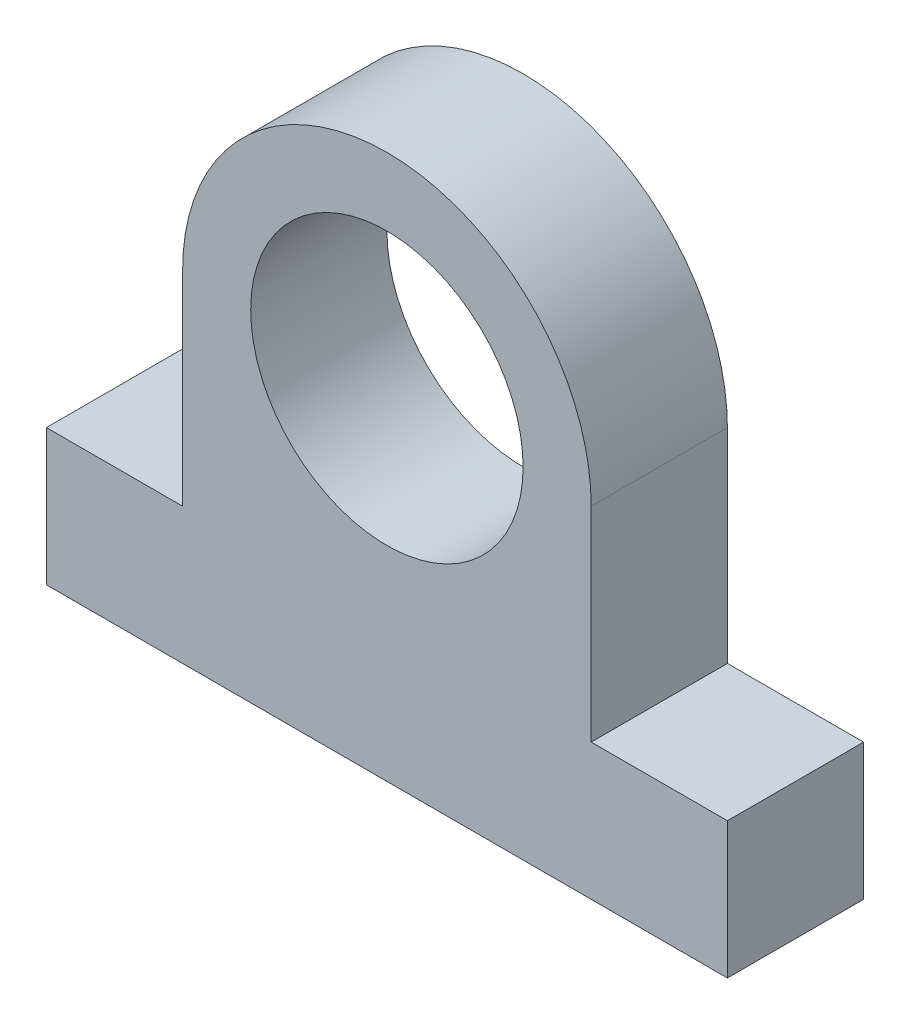
ISO-10303-21;
HEADER;
FILE_DESCRIPTION(('STEP AP214'),'2;1');
FILE_NAME('part.step','',(''),(''),'','','');
FILE_SCHEMA(('AUTOMOTIVE_DESIGN { 1 0 10303 214 1 1 1 1 }'));
ENDSEC;
DATA;
#1=APPLICATION_CONTEXT('core data for automotive mechanical design processes');
#2=APPLICATION_PROTOCOL_DEFINITION('international standard','automotive_design',2000,#1);
#3=PRODUCT_CONTEXT('',#1,'mechanical');
#4=PRODUCT('Part','Part','',(#3));
#5=PRODUCT_RELATED_PRODUCT_CATEGORY('part','',(#4));
#6=PRODUCT_DEFINITION_FORMATION('','',#4);
#7=PRODUCT_DEFINITION_CONTEXT('part definition',#1,'design');
#8=PRODUCT_DEFINITION('design','',#6,#7);
#9=PRODUCT_DEFINITION_SHAPE('','',#8);
#10=(LENGTH_UNIT() NAMED_UNIT(*) SI_UNIT(.MILLI.,.METRE.));
#11=(NAMED_UNIT(*) PLANE_ANGLE_UNIT() SI_UNIT($,.RADIAN.));
#12=(NAMED_UNIT(*) SI_UNIT($,.STERADIAN.) SOLID_ANGLE_UNIT());
#13=UNCERTAINTY_MEASURE_WITH_UNIT(LENGTH_MEASURE(1.E-05),#10,'distance_accuracy_value','');
#14=(GEOMETRIC_REPRESENTATION_CONTEXT(3) GLOBAL_UNCERTAINTY_ASSIGNED_CONTEXT((#13)) GLOBAL_UNIT_ASSIGNED_CONTEXT((#10,
#11,#12)) REPRESENTATION_CONTEXT('',''));
#15=CARTESIAN_POINT('',(0.,0.,0.));
#16=DIRECTION('',(0.,0.,1.));
#17=DIRECTION('',(1.,0.,0.));
#18=AXIS2_PLACEMENT_3D('',#15,#16,#17);
#19=CARTESIAN_POINT('',(0.110311447811456,19.9352377946128,10.));
#20=DIRECTION('',(0.,0.,-1.));
#21=DIRECTION('',(-1.,0.,0.));
#22=AXIS2_PLACEMENT_3D('',#19,#20,#21);
#23=CYLINDRICAL_SURFACE('',#22,15.);
#24=CARTESIAN_POINT('',(0.110311447811456,19.9352377946128,0.));
#25=DIRECTION('',(0.,0.,1.));
#26=DIRECTION('',(1.,0.,0.));
#27=AXIS2_PLACEMENT_3D('',#24,#25,#26);
#28=CIRCLE('',#27,15.);
#29=CARTESIAN_POINT('',(-14.8896885521885,19.9352377946128,0.));
#30=VERTEX_POINT('',#29);
#31=CARTESIAN_POINT('',(15.1103114478115,19.9352377946128,0.));
#32=VERTEX_POINT('',#31);
#33=EDGE_CURVE('E103',#30,#32,#28,.F.);
#34=ORIENTED_EDGE('',*,*,#33,.F.);
#35=DIRECTION('',(0.,0.,-1.));
#36=VECTOR('',#35,1.);
#37=CARTESIAN_POINT('',(-14.8896885521885,19.9352377946128,10.));
#38=LINE('',#37,#36);
#39=CARTESIAN_POINT('',(-14.8896885521885,19.9352377946128,10.));
#40=VERTEX_POINT('',#39);
#41=EDGE_CURVE('E11',#40,#30,#38,.T.);
#42=ORIENTED_EDGE('',*,*,#41,.F.);
#43=CARTESIAN_POINT('',(0.110311447811456,19.9352377946128,10.));
#44=DIRECTION('',(0.,0.,1.));
#45=DIRECTION('',(1.,0.,0.));
#46=AXIS2_PLACEMENT_3D('',#43,#44,#45);
#47=CIRCLE('',#46,15.);
#48=CARTESIAN_POINT('',(15.1103114478115,19.9352377946128,10.));
#49=VERTEX_POINT('',#48);
#50=EDGE_CURVE('E132',#40,#49,#47,.F.);
#51=ORIENTED_EDGE('',*,*,#50,.T.);
#52=DIRECTION('',(0.,0.,-1.));
#53=VECTOR('',#52,1.);
#54=CARTESIAN_POINT('',(15.1103114478115,19.9352377946128,10.));
#55=LINE('',#54,#53);
#56=EDGE_CURVE('E104',#49,#32,#55,.T.);
#57=ORIENTED_EDGE('',*,*,#56,.T.);
#58=EDGE_LOOP('',(#34,#42,#51,#57));
#59=FACE_BOUND('',#58,.T.);
#60=ADVANCED_FACE('F31',(#59),#23,.T.);
#61=CARTESIAN_POINT('',(-14.8896885521886,-51.4683054412894,10.));
#62=DIRECTION('',(-1.,0.,0.));
#63=DIRECTION('',(0.,-1.,0.));
#64=AXIS2_PLACEMENT_3D('',#61,#62,#63);
#65=PLANE('',#64);
#66=DIRECTION('',(0.,1.,0.));
#67=VECTOR('',#66,1.);
#68=CARTESIAN_POINT('',(-14.8896885521886,-51.4683054412894,0.));
#69=LINE('',#68,#67);
#70=CARTESIAN_POINT('',(-14.8896885521885,4.9352377946128,0.));
#71=VERTEX_POINT('',#70);
#72=EDGE_CURVE('E97',#71,#30,#69,.T.);
#73=ORIENTED_EDGE('',*,*,#72,.F.);
#74=DIRECTION('',(0.,0.,-1.));
#75=VECTOR('',#74,1.);
#76=CARTESIAN_POINT('',(-14.8896885521885,4.9352377946128,10.));
#77=LINE('',#76,#75);
#78=CARTESIAN_POINT('',(-14.8896885521885,4.9352377946128,10.));
#79=VERTEX_POINT('',#78);
#80=EDGE_CURVE('E39',#79,#71,#77,.T.);
#81=ORIENTED_EDGE('',*,*,#80,.F.);
#82=DIRECTION('',(0.,1.,0.));
#83=VECTOR('',#82,1.);
#84=CARTESIAN_POINT('',(-14.8896885521886,-51.4683054412894,10.));
#85=LINE('',#84,#83);
#86=EDGE_CURVE('E99',#79,#40,#85,.T.);
#87=ORIENTED_EDGE('',*,*,#86,.T.);
#88=ORIENTED_EDGE('',*,*,#41,.T.);
#89=EDGE_LOOP('',(#73,#81,#87,#88));
#90=FACE_BOUND('',#89,.T.);
#91=ADVANCED_FACE('F95',(#90),#65,.T.);
#92=CARTESIAN_POINT('',(1.27592519419598,4.9352377946128,10.));
#93=DIRECTION('',(0.,-1.,0.));
#94=DIRECTION('',(1.,0.,0.));
#95=AXIS2_PLACEMENT_3D('',#92,#93,#94);
#96=PLANE('',#95);
#97=DIRECTION('',(-1.,0.,0.));
#98=VECTOR('',#97,1.);
#99=CARTESIAN_POINT('',(1.27592519419598,4.9352377946128,0.));
#100=LINE('',#99,#98);
#101=CARTESIAN_POINT('',(-24.8896885521886,4.9352377946128,0.));
#102=VERTEX_POINT('',#101);
#103=EDGE_CURVE('E112',#71,#102,#100,.T.);
#104=ORIENTED_EDGE('',*,*,#103,.T.);
#105=DIRECTION('',(0.,0.,-1.));
#106=VECTOR('',#105,1.);
#107=CARTESIAN_POINT('',(-24.8896885521886,4.9352377946128,10.));
#108=LINE('',#107,#106);
#109=CARTESIAN_POINT('',(-24.8896885521886,4.9352377946128,10.));
#110=VERTEX_POINT('',#109);
#111=EDGE_CURVE('E157',#110,#102,#108,.T.);
#112=ORIENTED_EDGE('',*,*,#111,.F.);
#113=DIRECTION('',(-1.,0.,0.));
#114=VECTOR('',#113,1.);
#115=CARTESIAN_POINT('',(1.27592519419598,4.9352377946128,10.));
#116=LINE('',#115,#114);
#117=EDGE_CURVE('E135',#79,#110,#116,.T.);
#118=ORIENTED_EDGE('',*,*,#117,.F.);
#119=ORIENTED_EDGE('',*,*,#80,.T.);
#120=EDGE_LOOP('',(#104,#112,#118,#119));
#121=FACE_BOUND('',#120,.T.);
#122=ADVANCED_FACE('F161',(#121),#96,.F.);
#123=CARTESIAN_POINT('',(-24.8896885521886,-51.4683054412894,10.));
#124=DIRECTION('',(1.,0.,0.));
#125=DIRECTION('',(0.,0.,-1.));
#126=AXIS2_PLACEMENT_3D('',#123,#124,#125);
#127=PLANE('',#126);
#128=DIRECTION('',(0.,-1.,0.));
#129=VECTOR('',#128,1.);
#130=CARTESIAN_POINT('',(-24.8896885521886,-51.4683054412894,0.));
#131=LINE('',#130,#129);
#132=CARTESIAN_POINT('',(-24.8896885521886,-5.0647622053872,0.));
#133=VERTEX_POINT('',#132);
#134=EDGE_CURVE('E114',#102,#133,#131,.T.);
#135=ORIENTED_EDGE('',*,*,#134,.T.);
#136=DIRECTION('',(0.,0.,-1.));
#137=VECTOR('',#136,1.);
#138=CARTESIAN_POINT('',(-24.8896885521886,-5.0647622053872,10.));
#139=LINE('',#138,#137);
#140=CARTESIAN_POINT('',(-24.8896885521886,-5.0647622053872,10.));
#141=VERTEX_POINT('',#140);
#142=EDGE_CURVE('E155',#141,#133,#139,.T.);
#143=ORIENTED_EDGE('',*,*,#142,.F.);
#144=DIRECTION('',(0.,-1.,0.));
#145=VECTOR('',#144,1.);
#146=CARTESIAN_POINT('',(-24.8896885521886,-51.4683054412894,10.));
#147=LINE('',#146,#145);
#148=EDGE_CURVE('E138',#110,#141,#147,.T.);
#149=ORIENTED_EDGE('',*,*,#148,.F.);
#150=ORIENTED_EDGE('',*,*,#111,.T.);
#151=EDGE_LOOP('',(#135,#143,#149,#150));
#152=FACE_BOUND('',#151,.T.);
#153=ADVANCED_FACE('F182',(#152),#127,.F.);
#154=CARTESIAN_POINT('',(1.27592519419598,-5.0647622053872,10.));
#155=DIRECTION('',(0.,-1.,0.));
#156=DIRECTION('',(1.,0.,0.));
#157=AXIS2_PLACEMENT_3D('',#154,#155,#156);
#158=PLANE('',#157);
#159=DIRECTION('',(-1.,0.,0.));
#160=VECTOR('',#159,1.);
#161=CARTESIAN_POINT('',(1.27592519419598,-5.0647622053872,0.));
#162=LINE('',#161,#160);
#163=CARTESIAN_POINT('',(25.1103114478115,-5.0647622053872,0.));
#164=VERTEX_POINT('',#163);
#165=EDGE_CURVE('E121',#164,#133,#162,.T.);
#166=ORIENTED_EDGE('',*,*,#165,.F.);
#167=DIRECTION('',(0.,0.,-1.));
#168=VECTOR('',#167,1.);
#169=CARTESIAN_POINT('',(25.1103114478115,-5.0647622053872,10.));
#170=LINE('',#169,#168);
#171=CARTESIAN_POINT('',(25.1103114478115,-5.0647622053872,10.));
#172=VERTEX_POINT('',#171);
#173=EDGE_CURVE('E153',#172,#164,#170,.T.);
#174=ORIENTED_EDGE('',*,*,#173,.F.);
#175=DIRECTION('',(-1.,0.,0.));
#176=VECTOR('',#175,1.);
#177=CARTESIAN_POINT('',(1.27592519419598,-5.0647622053872,10.));
#178=LINE('',#177,#176);
#179=EDGE_CURVE('E141',#172,#141,#178,.T.);
#180=ORIENTED_EDGE('',*,*,#179,.T.);
#181=ORIENTED_EDGE('',*,*,#142,.T.);
#182=EDGE_LOOP('',(#166,#174,#180,#181));
#183=FACE_BOUND('',#182,.T.);
#184=ADVANCED_FACE('F185',(#183),#158,.T.);
#185=CARTESIAN_POINT('',(25.1103114478115,-51.4683054412894,10.));
#186=DIRECTION('',(1.,0.,0.));
#187=DIRECTION('',(0.,0.,-1.));
#188=AXIS2_PLACEMENT_3D('',#185,#186,#187);
#189=PLANE('',#188);
#190=DIRECTION('',(0.,-1.,0.));
#191=VECTOR('',#190,1.);
#192=CARTESIAN_POINT('',(25.1103114478115,-51.4683054412894,0.));
#193=LINE('',#192,#191);
#194=CARTESIAN_POINT('',(25.1103114478114,4.9352377946128,0.));
#195=VERTEX_POINT('',#194);
#196=EDGE_CURVE('E124',#195,#164,#193,.T.);
#197=ORIENTED_EDGE('',*,*,#196,.F.);
#198=DIRECTION('',(0.,0.,-1.));
#199=VECTOR('',#198,1.);
#200=CARTESIAN_POINT('',(25.1103114478114,4.9352377946128,10.));
#201=LINE('',#200,#199);
#202=CARTESIAN_POINT('',(25.1103114478114,4.9352377946128,10.));
#203=VERTEX_POINT('',#202);
#204=EDGE_CURVE('E151',#203,#195,#201,.T.);
#205=ORIENTED_EDGE('',*,*,#204,.F.);
#206=DIRECTION('',(0.,-1.,0.));
#207=VECTOR('',#206,1.);
#208=CARTESIAN_POINT('',(25.1103114478115,-51.4683054412894,10.));
#209=LINE('',#208,#207);
#210=EDGE_CURVE('E144',#203,#172,#209,.T.);
#211=ORIENTED_EDGE('',*,*,#210,.T.);
#212=ORIENTED_EDGE('',*,*,#173,.T.);
#213=EDGE_LOOP('',(#197,#205,#211,#212));
#214=FACE_BOUND('',#213,.T.);
#215=ADVANCED_FACE('F189',(#214),#189,.T.);
#216=CARTESIAN_POINT('',(15.1103114478115,4.9352377946128,0.));
#217=VERTEX_POINT('',#216);
#218=EDGE_CURVE('E116',#195,#217,#100,.T.);
#219=ORIENTED_EDGE('',*,*,#218,.T.);
#220=DIRECTION('',(0.,0.,-1.));
#221=VECTOR('',#220,1.);
#222=CARTESIAN_POINT('',(15.1103114478115,4.9352377946128,10.));
#223=LINE('',#222,#221);
#224=CARTESIAN_POINT('',(15.1103114478115,4.9352377946128,10.));
#225=VERTEX_POINT('',#224);
#226=EDGE_CURVE('E149',#225,#217,#223,.T.);
#227=ORIENTED_EDGE('',*,*,#226,.F.);
#228=EDGE_CURVE('E139',#203,#225,#116,.T.);
#229=ORIENTED_EDGE('',*,*,#228,.F.);
#230=ORIENTED_EDGE('',*,*,#204,.T.);
#231=EDGE_LOOP('',(#219,#227,#229,#230));
#232=FACE_BOUND('',#231,.T.);
#233=ADVANCED_FACE('F193',(#232),#96,.F.);
#234=CARTESIAN_POINT('',(0.110311447811456,19.9352377946128,10.));
#235=DIRECTION('',(0.,0.,-1.));
#236=DIRECTION('',(-1.,0.,0.));
#237=AXIS2_PLACEMENT_3D('',#234,#235,#236);
#238=CYLINDRICAL_SURFACE('',#237,10.);
#239=CARTESIAN_POINT('',(0.110311447811456,19.9352377946128,10.));
#240=DIRECTION('',(0.,0.,1.));
#241=DIRECTION('',(1.,0.,0.));
#242=AXIS2_PLACEMENT_3D('',#239,#240,#241);
#243=CIRCLE('',#242,10.);
#244=CARTESIAN_POINT('',(10.1103114478115,19.9352377946128,10.));
#245=VERTEX_POINT('',#244);
#246=EDGE_CURVE('E129',#245,#245,#243,.T.);
#247=ORIENTED_EDGE('',*,*,#246,.T.);
#248=EDGE_LOOP('',(#247));
#249=FACE_BOUND('',#248,.T.);
#250=CARTESIAN_POINT('',(0.110311447811456,19.9352377946128,0.));
#251=DIRECTION('',(0.,0.,1.));
#252=DIRECTION('',(1.,0.,0.));
#253=AXIS2_PLACEMENT_3D('',#250,#251,#252);
#254=CIRCLE('',#253,10.);
#255=CARTESIAN_POINT('',(10.1103114478115,19.9352377946128,0.));
#256=VERTEX_POINT('',#255);
#257=EDGE_CURVE('E107',#256,#256,#254,.T.);
#258=ORIENTED_EDGE('',*,*,#257,.F.);
#259=EDGE_LOOP('',(#258));
#260=FACE_BOUND('',#259,.T.);
#261=ADVANCED_FACE('F33',(#249,#260),#238,.F.);
#262=CARTESIAN_POINT('',(15.1103114478115,-51.4683054412894,10.));
#263=DIRECTION('',(-1.,0.,0.));
#264=DIRECTION('',(0.,0.,1.));
#265=AXIS2_PLACEMENT_3D('',#262,#263,#264);
#266=PLANE('',#265);
#267=DIRECTION('',(0.,1.,0.));
#268=VECTOR('',#267,1.);
#269=CARTESIAN_POINT('',(15.1103114478115,-51.4683054412894,0.));
#270=LINE('',#269,#268);
#271=EDGE_CURVE('E127',#217,#32,#270,.T.);
#272=ORIENTED_EDGE('',*,*,#271,.T.);
#273=ORIENTED_EDGE('',*,*,#56,.F.);
#274=DIRECTION('',(0.,1.,0.));
#275=VECTOR('',#274,1.);
#276=CARTESIAN_POINT('',(15.1103114478115,-51.4683054412894,10.));
#277=LINE('',#276,#275);
#278=EDGE_CURVE('E46',#225,#49,#277,.T.);
#279=ORIENTED_EDGE('',*,*,#278,.F.);
#280=ORIENTED_EDGE('',*,*,#226,.T.);
#281=EDGE_LOOP('',(#272,#273,#279,#280));
#282=FACE_BOUND('',#281,.T.);
#283=ADVANCED_FACE('F165',(#282),#266,.F.);
#284=CARTESIAN_POINT('',(1.27592519419599,-51.4683054412894,10.));
#285=DIRECTION('',(0.,0.,1.));
#286=DIRECTION('',(1.,0.,0.));
#287=AXIS2_PLACEMENT_3D('',#284,#285,#286);
#288=PLANE('',#287);
#289=ORIENTED_EDGE('',*,*,#246,.F.);
#290=EDGE_LOOP('',(#289));
#291=FACE_BOUND('',#290,.T.);
#292=ORIENTED_EDGE('',*,*,#50,.F.);
#293=ORIENTED_EDGE('',*,*,#86,.F.);
#294=ORIENTED_EDGE('',*,*,#117,.T.);
#295=ORIENTED_EDGE('',*,*,#148,.T.);
#296=ORIENTED_EDGE('',*,*,#179,.F.);
#297=ORIENTED_EDGE('',*,*,#210,.F.);
#298=ORIENTED_EDGE('',*,*,#228,.T.);
#299=ORIENTED_EDGE('',*,*,#278,.T.);
#300=EDGE_LOOP('',(#292,#293,#294,#295,#296,#297,#298,#299));
#301=FACE_BOUND('',#300,.T.);
#302=ADVANCED_FACE('F163',(#291,#301),#288,.T.);
#303=CARTESIAN_POINT('',(1.27592519419599,-51.4683054412894,0.));
#304=DIRECTION('',(0.,0.,1.));
#305=DIRECTION('',(1.,0.,0.));
#306=AXIS2_PLACEMENT_3D('',#303,#304,#305);
#307=PLANE('',#306);
#308=ORIENTED_EDGE('',*,*,#257,.T.);
#309=EDGE_LOOP('',(#308));
#310=FACE_BOUND('',#309,.T.);
#311=ORIENTED_EDGE('',*,*,#33,.T.);
#312=ORIENTED_EDGE('',*,*,#271,.F.);
#313=ORIENTED_EDGE('',*,*,#218,.F.);
#314=ORIENTED_EDGE('',*,*,#196,.T.);
#315=ORIENTED_EDGE('',*,*,#165,.T.);
#316=ORIENTED_EDGE('',*,*,#134,.F.);
#317=ORIENTED_EDGE('',*,*,#103,.F.);
#318=ORIENTED_EDGE('',*,*,#72,.T.);
#319=EDGE_LOOP('',(#311,#312,#313,#314,#315,#316,#317,#318));
#320=FACE_BOUND('',#319,.T.);
#321=ADVANCED_FACE('F110',(#310,#320),#307,.F.);
#322=CLOSED_SHELL('',(#60,#91,#122,#153,#184,#215,#233,#261,#283,#302,#321));
#323=MANIFOLD_SOLID_BREP('B2',#322);
#324=ADVANCED_BREP_SHAPE_REPRESENTATION('',(#18,#323),#14);
#325=SHAPE_DEFINITION_REPRESENTATION(#9,#324);
ENDSEC;
END-ISO-10303-21;
